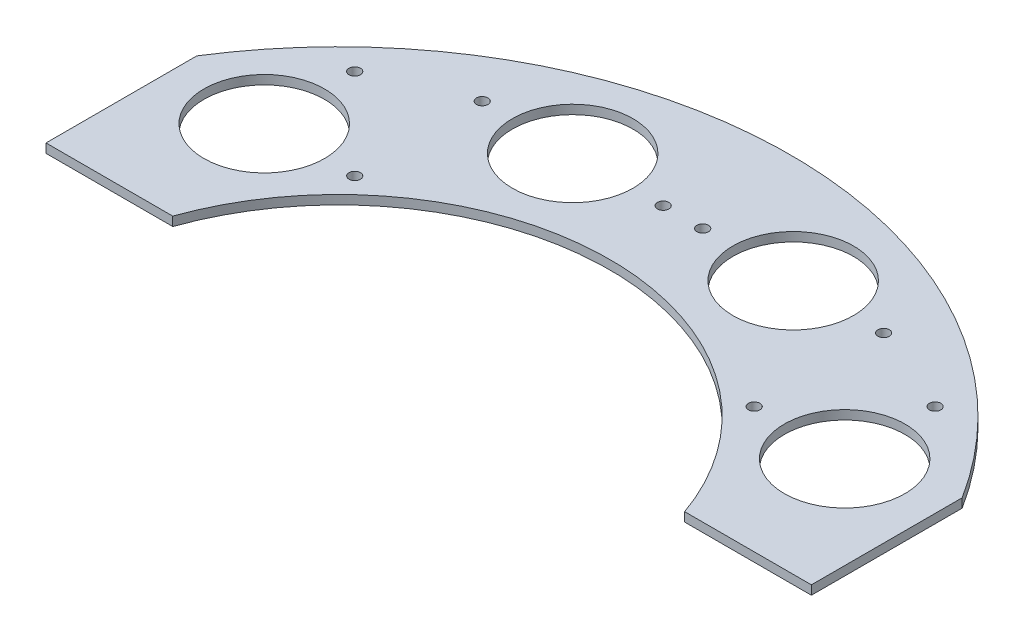
ISO-10303-21;
HEADER;
FILE_DESCRIPTION(('STEP AP214'),'2;1');
FILE_NAME('part.step','',(''),(''),'','','');
FILE_SCHEMA(('AUTOMOTIVE_DESIGN { 1 0 10303 214 1 1 1 1 }'));
ENDSEC;
DATA;
#1=APPLICATION_CONTEXT('core data for automotive mechanical design processes');
#2=APPLICATION_PROTOCOL_DEFINITION('international standard','automotive_design',2000,#1);
#3=PRODUCT_CONTEXT('',#1,'mechanical');
#4=PRODUCT('Part','Part','',(#3));
#5=PRODUCT_RELATED_PRODUCT_CATEGORY('part','',(#4));
#6=PRODUCT_DEFINITION_FORMATION('','',#4);
#7=PRODUCT_DEFINITION_CONTEXT('part definition',#1,'design');
#8=PRODUCT_DEFINITION('design','',#6,#7);
#9=PRODUCT_DEFINITION_SHAPE('','',#8);
#10=(LENGTH_UNIT() NAMED_UNIT(*) SI_UNIT(.MILLI.,.METRE.));
#11=(NAMED_UNIT(*) PLANE_ANGLE_UNIT() SI_UNIT($,.RADIAN.));
#12=(NAMED_UNIT(*) SI_UNIT($,.STERADIAN.) SOLID_ANGLE_UNIT());
#13=UNCERTAINTY_MEASURE_WITH_UNIT(LENGTH_MEASURE(1.E-05),#10,'distance_accuracy_value','');
#14=(GEOMETRIC_REPRESENTATION_CONTEXT(3) GLOBAL_UNCERTAINTY_ASSIGNED_CONTEXT((#13)) GLOBAL_UNIT_ASSIGNED_CONTEXT((#10,
#11,#12)) REPRESENTATION_CONTEXT('',''));
#15=CARTESIAN_POINT('',(0.,0.,0.));
#16=DIRECTION('',(0.,0.,1.));
#17=DIRECTION('',(1.,0.,0.));
#18=AXIS2_PLACEMENT_3D('',#15,#16,#17);
#19=CARTESIAN_POINT('',(126.885775404495,3.,0.));
#20=DIRECTION('',(-1.,0.,0.));
#21=DIRECTION('',(0.,0.,1.));
#22=AXIS2_PLACEMENT_3D('',#19,#20,#21);
#23=PLANE('',#22);
#24=DIRECTION('',(0.,0.,-1.));
#25=VECTOR('',#24,1.);
#26=CARTESIAN_POINT('',(126.885775404495,0.,0.));
#27=LINE('',#26,#25);
#28=CARTESIAN_POINT('',(126.885775404495,0.,16.7898324885886));
#29=VERTEX_POINT('',#28);
#30=CARTESIAN_POINT('',(126.885775404495,0.,-33.2101675114114));
#31=VERTEX_POINT('',#30);
#32=EDGE_CURVE('E133',#29,#31,#27,.T.);
#33=ORIENTED_EDGE('',*,*,#32,.T.);
#34=DIRECTION('',(0.,-1.,0.));
#35=VECTOR('',#34,1.);
#36=CARTESIAN_POINT('',(126.885775404495,3.,-33.2101675114114));
#37=LINE('',#36,#35);
#38=CARTESIAN_POINT('',(126.885775404495,3.,-33.2101675114114));
#39=VERTEX_POINT('',#38);
#40=EDGE_CURVE('E11',#39,#31,#37,.T.);
#41=ORIENTED_EDGE('',*,*,#40,.F.);
#42=DIRECTION('',(0.,0.,-1.));
#43=VECTOR('',#42,1.);
#44=CARTESIAN_POINT('',(126.885775404495,3.,0.));
#45=LINE('',#44,#43);
#46=CARTESIAN_POINT('',(126.885775404495,3.,16.7898324885886));
#47=VERTEX_POINT('',#46);
#48=EDGE_CURVE('E159',#47,#39,#45,.T.);
#49=ORIENTED_EDGE('',*,*,#48,.F.);
#50=DIRECTION('',(0.,-1.,0.));
#51=VECTOR('',#50,1.);
#52=CARTESIAN_POINT('',(126.885775404495,3.,16.7898324885886));
#53=LINE('',#52,#51);
#54=EDGE_CURVE('E116',#47,#29,#53,.T.);
#55=ORIENTED_EDGE('',*,*,#54,.T.);
#56=EDGE_LOOP('',(#33,#41,#49,#55));
#57=FACE_BOUND('',#56,.T.);
#58=ADVANCED_FACE('F37',(#57),#23,.F.);
#59=CARTESIAN_POINT('',(0.,3.,46.7898324885886));
#60=DIRECTION('',(0.,-1.,0.));
#61=DIRECTION('',(0.,0.,-1.));
#62=AXIS2_PLACEMENT_3D('',#59,#60,#61);
#63=CYLINDRICAL_SURFACE('',#62,150.);
#64=CARTESIAN_POINT('',(0.,0.,46.7898324885886));
#65=DIRECTION('',(0.,1.,0.));
#66=DIRECTION('',(0.,0.,1.));
#67=AXIS2_PLACEMENT_3D('',#64,#65,#66);
#68=CIRCLE('',#67,150.);
#69=CARTESIAN_POINT('',(-126.885775404495,0.,-33.2101675114114));
#70=VERTEX_POINT('',#69);
#71=EDGE_CURVE('E136',#31,#70,#68,.T.);
#72=ORIENTED_EDGE('',*,*,#71,.T.);
#73=DIRECTION('',(0.,-1.,0.));
#74=VECTOR('',#73,1.);
#75=CARTESIAN_POINT('',(-126.885775404495,3.,-33.2101675114114));
#76=LINE('',#75,#74);
#77=CARTESIAN_POINT('',(-126.885775404495,3.,-33.2101675114114));
#78=VERTEX_POINT('',#77);
#79=EDGE_CURVE('E46',#78,#70,#76,.T.);
#80=ORIENTED_EDGE('',*,*,#79,.F.);
#81=CARTESIAN_POINT('',(0.,3.,46.7898324885886));
#82=DIRECTION('',(0.,1.,0.));
#83=DIRECTION('',(0.,0.,1.));
#84=AXIS2_PLACEMENT_3D('',#81,#82,#83);
#85=CIRCLE('',#84,150.);
#86=EDGE_CURVE('E87',#39,#78,#85,.T.);
#87=ORIENTED_EDGE('',*,*,#86,.F.);
#88=ORIENTED_EDGE('',*,*,#40,.T.);
#89=EDGE_LOOP('',(#72,#80,#87,#88));
#90=FACE_BOUND('',#89,.T.);
#91=ADVANCED_FACE('F152',(#90),#63,.T.);
#92=CARTESIAN_POINT('',(-126.885775404495,3.,0.));
#93=DIRECTION('',(-1.,0.,0.));
#94=DIRECTION('',(0.,0.,1.));
#95=AXIS2_PLACEMENT_3D('',#92,#93,#94);
#96=PLANE('',#95);
#97=DIRECTION('',(0.,0.,-1.));
#98=VECTOR('',#97,1.);
#99=CARTESIAN_POINT('',(-126.885775404495,0.,0.));
#100=LINE('',#99,#98);
#101=CARTESIAN_POINT('',(-126.885775404495,0.,16.7898324885886));
#102=VERTEX_POINT('',#101);
#103=EDGE_CURVE('E139',#102,#70,#100,.T.);
#104=ORIENTED_EDGE('',*,*,#103,.F.);
#105=DIRECTION('',(0.,-1.,0.));
#106=VECTOR('',#105,1.);
#107=CARTESIAN_POINT('',(-126.885775404495,3.,16.7898324885886));
#108=LINE('',#107,#106);
#109=CARTESIAN_POINT('',(-126.885775404495,3.,16.7898324885886));
#110=VERTEX_POINT('',#109);
#111=EDGE_CURVE('E112',#110,#102,#108,.T.);
#112=ORIENTED_EDGE('',*,*,#111,.F.);
#113=DIRECTION('',(0.,0.,-1.));
#114=VECTOR('',#113,1.);
#115=CARTESIAN_POINT('',(-126.885775404495,3.,0.));
#116=LINE('',#115,#114);
#117=EDGE_CURVE('E101',#110,#78,#116,.T.);
#118=ORIENTED_EDGE('',*,*,#117,.T.);
#119=ORIENTED_EDGE('',*,*,#79,.T.);
#120=EDGE_LOOP('',(#104,#112,#118,#119));
#121=FACE_BOUND('',#120,.T.);
#122=ADVANCED_FACE('F151',(#121),#96,.T.);
#123=CARTESIAN_POINT('',(0.,3.,16.7898324885886));
#124=DIRECTION('',(0.,0.,-1.));
#125=DIRECTION('',(-1.,0.,0.));
#126=AXIS2_PLACEMENT_3D('',#123,#124,#125);
#127=PLANE('',#126);
#128=DIRECTION('',(1.,0.,0.));
#129=VECTOR('',#128,1.);
#130=CARTESIAN_POINT('',(0.,0.,16.7898324885886));
#131=LINE('',#130,#129);
#132=CARTESIAN_POINT('',(-84.8716884499019,0.,16.7898324885886));
#133=VERTEX_POINT('',#132);
#134=EDGE_CURVE('E108',#102,#133,#131,.T.);
#135=ORIENTED_EDGE('',*,*,#134,.T.);
#136=DIRECTION('',(0.,-1.,0.));
#137=VECTOR('',#136,1.);
#138=CARTESIAN_POINT('',(-84.8716884499019,3.,16.7898324885886));
#139=LINE('',#138,#137);
#140=CARTESIAN_POINT('',(-84.8716884499019,3.,16.7898324885886));
#141=VERTEX_POINT('',#140);
#142=EDGE_CURVE('E105',#141,#133,#139,.T.);
#143=ORIENTED_EDGE('',*,*,#142,.F.);
#144=DIRECTION('',(1.,0.,0.));
#145=VECTOR('',#144,1.);
#146=CARTESIAN_POINT('',(0.,3.,16.7898324885886));
#147=LINE('',#146,#145);
#148=EDGE_CURVE('E95',#110,#141,#147,.T.);
#149=ORIENTED_EDGE('',*,*,#148,.F.);
#150=ORIENTED_EDGE('',*,*,#111,.T.);
#151=EDGE_LOOP('',(#135,#143,#149,#150));
#152=FACE_BOUND('',#151,.T.);
#153=ADVANCED_FACE('F106',(#152),#127,.F.);
#154=CARTESIAN_POINT('',(0.,3.,46.7898324885886));
#155=DIRECTION('',(0.,-1.,0.));
#156=DIRECTION('',(0.,0.,-1.));
#157=AXIS2_PLACEMENT_3D('',#154,#155,#156);
#158=CYLINDRICAL_SURFACE('',#157,90.0177954647702);
#159=CARTESIAN_POINT('',(0.,0.,46.7898324885886));
#160=DIRECTION('',(0.,1.,0.));
#161=DIRECTION('',(0.,0.,1.));
#162=AXIS2_PLACEMENT_3D('',#159,#160,#161);
#163=CIRCLE('',#162,90.0177954647702);
#164=CARTESIAN_POINT('',(84.8716884499019,0.,16.7898324885886));
#165=VERTEX_POINT('',#164);
#166=EDGE_CURVE('E143',#165,#133,#163,.T.);
#167=ORIENTED_EDGE('',*,*,#166,.F.);
#168=DIRECTION('',(0.,-1.,0.));
#169=VECTOR('',#168,1.);
#170=CARTESIAN_POINT('',(84.8716884499019,3.,16.7898324885886));
#171=LINE('',#170,#169);
#172=CARTESIAN_POINT('',(84.8716884499019,3.,16.7898324885886));
#173=VERTEX_POINT('',#172);
#174=EDGE_CURVE('E76',#173,#165,#171,.T.);
#175=ORIENTED_EDGE('',*,*,#174,.F.);
#176=CARTESIAN_POINT('',(0.,3.,46.7898324885886));
#177=DIRECTION('',(0.,1.,0.));
#178=DIRECTION('',(0.,0.,1.));
#179=AXIS2_PLACEMENT_3D('',#176,#177,#178);
#180=CIRCLE('',#179,90.0177954647702);
#181=EDGE_CURVE('E99',#173,#141,#180,.T.);
#182=ORIENTED_EDGE('',*,*,#181,.T.);
#183=ORIENTED_EDGE('',*,*,#142,.T.);
#184=EDGE_LOOP('',(#167,#175,#182,#183));
#185=FACE_BOUND('',#184,.T.);
#186=ADVANCED_FACE('F114',(#185),#158,.F.);
#187=CARTESIAN_POINT('',(36.5556268754658,3.,-67.5066510257423));
#188=DIRECTION('',(0.,-1.,0.));
#189=DIRECTION('',(0.,0.,-1.));
#190=AXIS2_PLACEMENT_3D('',#187,#188,#189);
#191=CYLINDRICAL_SURFACE('',#190,20.);
#192=CARTESIAN_POINT('',(36.5556268754658,3.,-67.5066510257423));
#193=DIRECTION('',(0.,1.,0.));
#194=DIRECTION('',(0.,0.,1.));
#195=AXIS2_PLACEMENT_3D('',#192,#193,#194);
#196=CIRCLE('',#195,20.);
#197=CARTESIAN_POINT('',(36.5556268754658,3.,-47.5066510257423));
#198=VERTEX_POINT('',#197);
#199=EDGE_CURVE('E302',#198,#198,#196,.F.);
#200=ORIENTED_EDGE('',*,*,#199,.F.);
#201=EDGE_LOOP('',(#200));
#202=FACE_BOUND('',#201,.T.);
#203=CARTESIAN_POINT('',(36.5556268754658,0.,-67.5066510257423));
#204=DIRECTION('',(0.,1.,0.));
#205=DIRECTION('',(0.,0.,1.));
#206=AXIS2_PLACEMENT_3D('',#203,#204,#205);
#207=CIRCLE('',#206,20.);
#208=CARTESIAN_POINT('',(36.5556268754658,0.,-47.5066510257423));
#209=VERTEX_POINT('',#208);
#210=EDGE_CURVE('E130',#209,#209,#207,.F.);
#211=ORIENTED_EDGE('',*,*,#210,.T.);
#212=EDGE_LOOP('',(#211));
#213=FACE_BOUND('',#212,.T.);
#214=ADVANCED_FACE('F182',(#202,#213),#191,.F.);
#215=CARTESIAN_POINT('',(-96.2238553059831,3.,-24.9107230884307));
#216=DIRECTION('',(0.,-1.,0.));
#217=DIRECTION('',(0.,0.,-1.));
#218=AXIS2_PLACEMENT_3D('',#215,#216,#217);
#219=CYLINDRICAL_SURFACE('',#218,20.);
#220=CARTESIAN_POINT('',(-96.2238553059831,3.,-24.9107230884307));
#221=DIRECTION('',(0.,1.,0.));
#222=DIRECTION('',(0.,0.,1.));
#223=AXIS2_PLACEMENT_3D('',#220,#221,#222);
#224=CIRCLE('',#223,20.);
#225=CARTESIAN_POINT('',(-96.2238553059831,3.,-4.91072308843064));
#226=VERTEX_POINT('',#225);
#227=EDGE_CURVE('E299',#226,#226,#224,.T.);
#228=ORIENTED_EDGE('',*,*,#227,.T.);
#229=EDGE_LOOP('',(#228));
#230=FACE_BOUND('',#229,.T.);
#231=CARTESIAN_POINT('',(-96.2238553059831,0.,-24.9107230884307));
#232=DIRECTION('',(0.,1.,0.));
#233=DIRECTION('',(0.,0.,1.));
#234=AXIS2_PLACEMENT_3D('',#231,#232,#233);
#235=CIRCLE('',#234,20.);
#236=CARTESIAN_POINT('',(-96.2238553059831,0.,-4.91072308843064));
#237=VERTEX_POINT('',#236);
#238=EDGE_CURVE('E127',#237,#237,#235,.T.);
#239=ORIENTED_EDGE('',*,*,#238,.F.);
#240=EDGE_LOOP('',(#239));
#241=FACE_BOUND('',#240,.T.);
#242=ADVANCED_FACE('F185',(#230,#241),#219,.F.);
#243=CARTESIAN_POINT('',(-36.5556268754658,3.,-67.5066510257423));
#244=DIRECTION('',(0.,-1.,0.));
#245=DIRECTION('',(0.,0.,-1.));
#246=AXIS2_PLACEMENT_3D('',#243,#244,#245);
#247=CYLINDRICAL_SURFACE('',#246,20.);
#248=CARTESIAN_POINT('',(-36.5556268754658,3.,-67.5066510257423));
#249=DIRECTION('',(0.,1.,0.));
#250=DIRECTION('',(0.,0.,1.));
#251=AXIS2_PLACEMENT_3D('',#248,#249,#250);
#252=CIRCLE('',#251,20.);
#253=CARTESIAN_POINT('',(-36.5556268754658,3.,-47.5066510257423));
#254=VERTEX_POINT('',#253);
#255=EDGE_CURVE('E196',#254,#254,#252,.T.);
#256=ORIENTED_EDGE('',*,*,#255,.T.);
#257=EDGE_LOOP('',(#256));
#258=FACE_BOUND('',#257,.T.);
#259=CARTESIAN_POINT('',(-36.5556268754658,0.,-67.5066510257423));
#260=DIRECTION('',(0.,1.,0.));
#261=DIRECTION('',(0.,0.,1.));
#262=AXIS2_PLACEMENT_3D('',#259,#260,#261);
#263=CIRCLE('',#262,20.);
#264=CARTESIAN_POINT('',(-36.5556268754658,0.,-47.5066510257423));
#265=VERTEX_POINT('',#264);
#266=EDGE_CURVE('E123',#265,#265,#263,.T.);
#267=ORIENTED_EDGE('',*,*,#266,.F.);
#268=EDGE_LOOP('',(#267));
#269=FACE_BOUND('',#268,.T.);
#270=ADVANCED_FACE('F170',(#258,#269),#247,.F.);
#271=CARTESIAN_POINT('',(96.2238553059831,3.,-24.9107230884307));
#272=DIRECTION('',(0.,-1.,0.));
#273=DIRECTION('',(0.,0.,-1.));
#274=AXIS2_PLACEMENT_3D('',#271,#272,#273);
#275=CYLINDRICAL_SURFACE('',#274,20.);
#276=CARTESIAN_POINT('',(96.2238553059831,3.,-24.9107230884307));
#277=DIRECTION('',(0.,1.,0.));
#278=DIRECTION('',(0.,0.,1.));
#279=AXIS2_PLACEMENT_3D('',#276,#277,#278);
#280=CIRCLE('',#279,20.);
#281=CARTESIAN_POINT('',(96.2238553059831,3.,-4.91072308843069));
#282=VERTEX_POINT('',#281);
#283=EDGE_CURVE('E146',#282,#282,#280,.F.);
#284=ORIENTED_EDGE('',*,*,#283,.F.);
#285=EDGE_LOOP('',(#284));
#286=FACE_BOUND('',#285,.T.);
#287=CARTESIAN_POINT('',(96.2238553059831,0.,-24.9107230884307));
#288=DIRECTION('',(0.,1.,0.));
#289=DIRECTION('',(0.,0.,1.));
#290=AXIS2_PLACEMENT_3D('',#287,#288,#289);
#291=CIRCLE('',#290,20.);
#292=CARTESIAN_POINT('',(96.2238553059831,0.,-4.91072308843069));
#293=VERTEX_POINT('',#292);
#294=EDGE_CURVE('E120',#293,#293,#291,.F.);
#295=ORIENTED_EDGE('',*,*,#294,.T.);
#296=EDGE_LOOP('',(#295));
#297=FACE_BOUND('',#296,.T.);
#298=ADVANCED_FACE('F39',(#286,#297),#275,.F.);
#299=CARTESIAN_POINT('',(0.,3.,16.7898324885886));
#300=DIRECTION('',(0.,0.,-1.));
#301=DIRECTION('',(-1.,0.,0.));
#302=AXIS2_PLACEMENT_3D('',#299,#300,#301);
#303=PLANE('',#302);
#304=DIRECTION('',(1.,0.,0.));
#305=VECTOR('',#304,1.);
#306=CARTESIAN_POINT('',(0.,0.,16.7898324885886));
#307=LINE('',#306,#305);
#308=EDGE_CURVE('E79',#165,#29,#307,.T.);
#309=ORIENTED_EDGE('',*,*,#308,.T.);
#310=ORIENTED_EDGE('',*,*,#54,.F.);
#311=DIRECTION('',(1.,0.,0.));
#312=VECTOR('',#311,1.);
#313=CARTESIAN_POINT('',(0.,3.,16.7898324885886));
#314=LINE('',#313,#312);
#315=EDGE_CURVE('E54',#173,#47,#314,.T.);
#316=ORIENTED_EDGE('',*,*,#315,.F.);
#317=ORIENTED_EDGE('',*,*,#174,.T.);
#318=EDGE_LOOP('',(#309,#310,#316,#317));
#319=FACE_BOUND('',#318,.T.);
#320=ADVANCED_FACE('F160',(#319),#303,.F.);
#321=CARTESIAN_POINT('',(0.,3.,0.));
#322=DIRECTION('',(0.,1.,0.));
#323=DIRECTION('',(0.,0.,1.));
#324=AXIS2_PLACEMENT_3D('',#321,#322,#323);
#325=PLANE('',#324);
#326=CARTESIAN_POINT('',(-66.2238553059831,3.,-24.9107230884307));
#327=DIRECTION('',(0.,1.,0.));
#328=DIRECTION('',(0.,0.,1.));
#329=AXIS2_PLACEMENT_3D('',#326,#327,#328);
#330=CIRCLE('',#329,1.89865);
#331=CARTESIAN_POINT('',(-66.2238553059831,3.,-23.0120730884307));
#332=VERTEX_POINT('',#331);
#333=EDGE_CURVE('E251',#332,#332,#330,.T.);
#334=ORIENTED_EDGE('',*,*,#333,.F.);
#335=EDGE_LOOP('',(#334));
#336=FACE_BOUND('',#335,.T.);
#337=CARTESIAN_POINT('',(-96.2238553059831,3.,-54.9107230884307));
#338=DIRECTION('',(0.,1.,0.));
#339=DIRECTION('',(0.,0.,1.));
#340=AXIS2_PLACEMENT_3D('',#337,#338,#339);
#341=CIRCLE('',#340,1.89865);
#342=CARTESIAN_POINT('',(-96.2238553059831,3.,-53.0120730884307));
#343=VERTEX_POINT('',#342);
#344=EDGE_CURVE('E253',#343,#343,#341,.T.);
#345=ORIENTED_EDGE('',*,*,#344,.F.);
#346=EDGE_LOOP('',(#345));
#347=FACE_BOUND('',#346,.T.);
#348=CARTESIAN_POINT('',(-66.5556268754658,3.,-67.5066510257423));
#349=DIRECTION('',(0.,1.,0.));
#350=DIRECTION('',(0.,0.,1.));
#351=AXIS2_PLACEMENT_3D('',#348,#349,#350);
#352=CIRCLE('',#351,1.89865);
#353=CARTESIAN_POINT('',(-66.5556268754658,3.,-65.6080010257423));
#354=VERTEX_POINT('',#353);
#355=EDGE_CURVE('E261',#354,#354,#352,.T.);
#356=ORIENTED_EDGE('',*,*,#355,.F.);
#357=EDGE_LOOP('',(#356));
#358=FACE_BOUND('',#357,.T.);
#359=CARTESIAN_POINT('',(-6.55562687546583,3.,-67.5066510257423));
#360=DIRECTION('',(0.,1.,0.));
#361=DIRECTION('',(0.,0.,1.));
#362=AXIS2_PLACEMENT_3D('',#359,#360,#361);
#363=CIRCLE('',#362,1.89865);
#364=CARTESIAN_POINT('',(-6.55562687546583,3.,-65.6080010257423));
#365=VERTEX_POINT('',#364);
#366=EDGE_CURVE('E267',#365,#365,#363,.T.);
#367=ORIENTED_EDGE('',*,*,#366,.F.);
#368=EDGE_LOOP('',(#367));
#369=FACE_BOUND('',#368,.T.);
#370=CARTESIAN_POINT('',(6.55562687546583,3.,-67.5066510257423));
#371=DIRECTION('',(0.,1.,0.));
#372=DIRECTION('',(0.,0.,1.));
#373=AXIS2_PLACEMENT_3D('',#370,#371,#372);
#374=CIRCLE('',#373,1.89865);
#375=CARTESIAN_POINT('',(6.55562687546583,3.,-65.6080010257423));
#376=VERTEX_POINT('',#375);
#377=EDGE_CURVE('E273',#376,#376,#374,.T.);
#378=ORIENTED_EDGE('',*,*,#377,.F.);
#379=EDGE_LOOP('',(#378));
#380=FACE_BOUND('',#379,.T.);
#381=CARTESIAN_POINT('',(66.5556268754658,3.,-67.5066510257423));
#382=DIRECTION('',(0.,1.,0.));
#383=DIRECTION('',(0.,0.,1.));
#384=AXIS2_PLACEMENT_3D('',#381,#382,#383);
#385=CIRCLE('',#384,1.89865);
#386=CARTESIAN_POINT('',(66.5556268754658,3.,-65.6080010257423));
#387=VERTEX_POINT('',#386);
#388=EDGE_CURVE('E279',#387,#387,#385,.T.);
#389=ORIENTED_EDGE('',*,*,#388,.F.);
#390=EDGE_LOOP('',(#389));
#391=FACE_BOUND('',#390,.T.);
#392=CARTESIAN_POINT('',(96.2238553059831,3.,-54.9107230884307));
#393=DIRECTION('',(0.,1.,0.));
#394=DIRECTION('',(0.,0.,1.));
#395=AXIS2_PLACEMENT_3D('',#392,#393,#394);
#396=CIRCLE('',#395,1.89865);
#397=CARTESIAN_POINT('',(96.2238553059831,3.,-53.0120730884307));
#398=VERTEX_POINT('',#397);
#399=EDGE_CURVE('E285',#398,#398,#396,.T.);
#400=ORIENTED_EDGE('',*,*,#399,.F.);
#401=EDGE_LOOP('',(#400));
#402=FACE_BOUND('',#401,.T.);
#403=CARTESIAN_POINT('',(66.2238553059831,3.,-24.9107230884307));
#404=DIRECTION('',(0.,1.,0.));
#405=DIRECTION('',(0.,0.,1.));
#406=AXIS2_PLACEMENT_3D('',#403,#404,#405);
#407=CIRCLE('',#406,1.89865);
#408=CARTESIAN_POINT('',(66.2238553059831,3.,-23.0120730884307));
#409=VERTEX_POINT('',#408);
#410=EDGE_CURVE('E291',#409,#409,#407,.T.);
#411=ORIENTED_EDGE('',*,*,#410,.F.);
#412=EDGE_LOOP('',(#411));
#413=FACE_BOUND('',#412,.T.);
#414=ORIENTED_EDGE('',*,*,#283,.T.);
#415=EDGE_LOOP('',(#414));
#416=FACE_BOUND('',#415,.T.);
#417=ORIENTED_EDGE('',*,*,#255,.F.);
#418=EDGE_LOOP('',(#417));
#419=FACE_BOUND('',#418,.T.);
#420=ORIENTED_EDGE('',*,*,#227,.F.);
#421=EDGE_LOOP('',(#420));
#422=FACE_BOUND('',#421,.T.);
#423=ORIENTED_EDGE('',*,*,#199,.T.);
#424=EDGE_LOOP('',(#423));
#425=FACE_BOUND('',#424,.T.);
#426=ORIENTED_EDGE('',*,*,#48,.T.);
#427=ORIENTED_EDGE('',*,*,#86,.T.);
#428=ORIENTED_EDGE('',*,*,#117,.F.);
#429=ORIENTED_EDGE('',*,*,#148,.T.);
#430=ORIENTED_EDGE('',*,*,#181,.F.);
#431=ORIENTED_EDGE('',*,*,#315,.T.);
#432=EDGE_LOOP('',(#426,#427,#428,#429,#430,#431));
#433=FACE_BOUND('',#432,.T.);
#434=ADVANCED_FACE('F97',(#336,#347,#358,#369,#380,#391,#402,#413,#416,#419,#422,#425,#433),
#325,.T.);
#435=CARTESIAN_POINT('',(0.,0.,0.));
#436=DIRECTION('',(0.,1.,0.));
#437=DIRECTION('',(0.,0.,1.));
#438=AXIS2_PLACEMENT_3D('',#435,#436,#437);
#439=PLANE('',#438);
#440=CARTESIAN_POINT('',(-66.2238553059831,0.,-24.9107230884307));
#441=DIRECTION('',(0.,1.,0.));
#442=DIRECTION('',(0.,0.,1.));
#443=AXIS2_PLACEMENT_3D('',#440,#441,#442);
#444=CIRCLE('',#443,1.89865);
#445=CARTESIAN_POINT('',(-66.2238553059831,0.,-23.0120730884307));
#446=VERTEX_POINT('',#445);
#447=EDGE_CURVE('E248',#446,#446,#444,.T.);
#448=ORIENTED_EDGE('',*,*,#447,.T.);
#449=EDGE_LOOP('',(#448));
#450=FACE_BOUND('',#449,.T.);
#451=CARTESIAN_POINT('',(-96.2238553059831,0.,-54.9107230884307));
#452=DIRECTION('',(0.,1.,0.));
#453=DIRECTION('',(0.,0.,1.));
#454=AXIS2_PLACEMENT_3D('',#451,#452,#453);
#455=CIRCLE('',#454,1.89865);
#456=CARTESIAN_POINT('',(-96.2238553059831,0.,-53.0120730884307));
#457=VERTEX_POINT('',#456);
#458=EDGE_CURVE('E258',#457,#457,#455,.T.);
#459=ORIENTED_EDGE('',*,*,#458,.T.);
#460=EDGE_LOOP('',(#459));
#461=FACE_BOUND('',#460,.T.);
#462=CARTESIAN_POINT('',(-66.5556268754658,0.,-67.5066510257423));
#463=DIRECTION('',(0.,1.,0.));
#464=DIRECTION('',(0.,0.,1.));
#465=AXIS2_PLACEMENT_3D('',#462,#463,#464);
#466=CIRCLE('',#465,1.89865);
#467=CARTESIAN_POINT('',(-66.5556268754658,0.,-65.6080010257423));
#468=VERTEX_POINT('',#467);
#469=EDGE_CURVE('E264',#468,#468,#466,.T.);
#470=ORIENTED_EDGE('',*,*,#469,.T.);
#471=EDGE_LOOP('',(#470));
#472=FACE_BOUND('',#471,.T.);
#473=CARTESIAN_POINT('',(-6.55562687546583,0.,-67.5066510257423));
#474=DIRECTION('',(0.,1.,0.));
#475=DIRECTION('',(0.,0.,1.));
#476=AXIS2_PLACEMENT_3D('',#473,#474,#475);
#477=CIRCLE('',#476,1.89865);
#478=CARTESIAN_POINT('',(-6.55562687546583,0.,-65.6080010257423));
#479=VERTEX_POINT('',#478);
#480=EDGE_CURVE('E270',#479,#479,#477,.T.);
#481=ORIENTED_EDGE('',*,*,#480,.T.);
#482=EDGE_LOOP('',(#481));
#483=FACE_BOUND('',#482,.T.);
#484=CARTESIAN_POINT('',(6.55562687546583,0.,-67.5066510257423));
#485=DIRECTION('',(0.,1.,0.));
#486=DIRECTION('',(0.,0.,1.));
#487=AXIS2_PLACEMENT_3D('',#484,#485,#486);
#488=CIRCLE('',#487,1.89864999999999);
#489=CARTESIAN_POINT('',(6.55562687546583,0.,-65.6080010257424));
#490=VERTEX_POINT('',#489);
#491=EDGE_CURVE('E276',#490,#490,#488,.T.);
#492=ORIENTED_EDGE('',*,*,#491,.T.);
#493=EDGE_LOOP('',(#492));
#494=FACE_BOUND('',#493,.T.);
#495=CARTESIAN_POINT('',(66.5556268754658,0.,-67.5066510257423));
#496=DIRECTION('',(0.,1.,0.));
#497=DIRECTION('',(0.,0.,1.));
#498=AXIS2_PLACEMENT_3D('',#495,#496,#497);
#499=CIRCLE('',#498,1.89865);
#500=CARTESIAN_POINT('',(66.5556268754658,0.,-65.6080010257423));
#501=VERTEX_POINT('',#500);
#502=EDGE_CURVE('E282',#501,#501,#499,.T.);
#503=ORIENTED_EDGE('',*,*,#502,.T.);
#504=EDGE_LOOP('',(#503));
#505=FACE_BOUND('',#504,.T.);
#506=CARTESIAN_POINT('',(96.2238553059831,0.,-54.9107230884307));
#507=DIRECTION('',(0.,1.,0.));
#508=DIRECTION('',(0.,0.,1.));
#509=AXIS2_PLACEMENT_3D('',#506,#507,#508);
#510=CIRCLE('',#509,1.89865);
#511=CARTESIAN_POINT('',(96.2238553059831,0.,-53.0120730884307));
#512=VERTEX_POINT('',#511);
#513=EDGE_CURVE('E288',#512,#512,#510,.T.);
#514=ORIENTED_EDGE('',*,*,#513,.T.);
#515=EDGE_LOOP('',(#514));
#516=FACE_BOUND('',#515,.T.);
#517=CARTESIAN_POINT('',(66.2238553059831,0.,-24.9107230884307));
#518=DIRECTION('',(0.,1.,0.));
#519=DIRECTION('',(0.,0.,1.));
#520=AXIS2_PLACEMENT_3D('',#517,#518,#519);
#521=CIRCLE('',#520,1.89865);
#522=CARTESIAN_POINT('',(66.2238553059831,0.,-23.0120730884307));
#523=VERTEX_POINT('',#522);
#524=EDGE_CURVE('E124',#523,#523,#521,.T.);
#525=ORIENTED_EDGE('',*,*,#524,.T.);
#526=EDGE_LOOP('',(#525));
#527=FACE_BOUND('',#526,.T.);
#528=ORIENTED_EDGE('',*,*,#294,.F.);
#529=EDGE_LOOP('',(#528));
#530=FACE_BOUND('',#529,.T.);
#531=ORIENTED_EDGE('',*,*,#266,.T.);
#532=EDGE_LOOP('',(#531));
#533=FACE_BOUND('',#532,.T.);
#534=ORIENTED_EDGE('',*,*,#238,.T.);
#535=EDGE_LOOP('',(#534));
#536=FACE_BOUND('',#535,.T.);
#537=ORIENTED_EDGE('',*,*,#210,.F.);
#538=EDGE_LOOP('',(#537));
#539=FACE_BOUND('',#538,.T.);
#540=ORIENTED_EDGE('',*,*,#32,.F.);
#541=ORIENTED_EDGE('',*,*,#308,.F.);
#542=ORIENTED_EDGE('',*,*,#166,.T.);
#543=ORIENTED_EDGE('',*,*,#134,.F.);
#544=ORIENTED_EDGE('',*,*,#103,.T.);
#545=ORIENTED_EDGE('',*,*,#71,.F.);
#546=EDGE_LOOP('',(#540,#541,#542,#543,#544,#545));
#547=FACE_BOUND('',#546,.T.);
#548=ADVANCED_FACE('F156',(#450,#461,#472,#483,#494,#505,#516,#527,#530,#533,#536,#539,#547),
#439,.F.);
#549=CARTESIAN_POINT('',(66.2238553059831,3.,-24.9107230884307));
#550=DIRECTION('',(0.,1.,0.));
#551=DIRECTION('',(0.,0.,1.));
#552=AXIS2_PLACEMENT_3D('',#549,#550,#551);
#553=CYLINDRICAL_SURFACE('',#552,1.89865);
#554=ORIENTED_EDGE('',*,*,#524,.F.);
#555=EDGE_LOOP('',(#554));
#556=FACE_BOUND('',#555,.T.);
#557=ORIENTED_EDGE('',*,*,#410,.T.);
#558=EDGE_LOOP('',(#557));
#559=FACE_BOUND('',#558,.T.);
#560=ADVANCED_FACE('F201',(#556,#559),#553,.F.);
#561=CARTESIAN_POINT('',(96.2238553059831,3.,-54.9107230884307));
#562=DIRECTION('',(0.,1.,0.));
#563=DIRECTION('',(0.,0.,1.));
#564=AXIS2_PLACEMENT_3D('',#561,#562,#563);
#565=CYLINDRICAL_SURFACE('',#564,1.89865);
#566=ORIENTED_EDGE('',*,*,#513,.F.);
#567=EDGE_LOOP('',(#566));
#568=FACE_BOUND('',#567,.T.);
#569=ORIENTED_EDGE('',*,*,#399,.T.);
#570=EDGE_LOOP('',(#569));
#571=FACE_BOUND('',#570,.T.);
#572=ADVANCED_FACE('F212',(#568,#571),#565,.F.);
#573=CARTESIAN_POINT('',(66.5556268754658,3.,-67.5066510257423));
#574=DIRECTION('',(0.,1.,0.));
#575=DIRECTION('',(0.,0.,1.));
#576=AXIS2_PLACEMENT_3D('',#573,#574,#575);
#577=CYLINDRICAL_SURFACE('',#576,1.89865);
#578=ORIENTED_EDGE('',*,*,#502,.F.);
#579=EDGE_LOOP('',(#578));
#580=FACE_BOUND('',#579,.T.);
#581=ORIENTED_EDGE('',*,*,#388,.T.);
#582=EDGE_LOOP('',(#581));
#583=FACE_BOUND('',#582,.T.);
#584=ADVANCED_FACE('F220',(#580,#583),#577,.F.);
#585=CARTESIAN_POINT('',(6.55562687546583,3.,-67.5066510257423));
#586=DIRECTION('',(0.,1.,0.));
#587=DIRECTION('',(0.,0.,1.));
#588=AXIS2_PLACEMENT_3D('',#585,#586,#587);
#589=CYLINDRICAL_SURFACE('',#588,1.89865);
#590=ORIENTED_EDGE('',*,*,#491,.F.);
#591=EDGE_LOOP('',(#590));
#592=FACE_BOUND('',#591,.T.);
#593=ORIENTED_EDGE('',*,*,#377,.T.);
#594=EDGE_LOOP('',(#593));
#595=FACE_BOUND('',#594,.T.);
#596=ADVANCED_FACE('F224',(#592,#595),#589,.F.);
#597=CARTESIAN_POINT('',(-6.55562687546583,3.,-67.5066510257423));
#598=DIRECTION('',(0.,1.,0.));
#599=DIRECTION('',(0.,0.,1.));
#600=AXIS2_PLACEMENT_3D('',#597,#598,#599);
#601=CYLINDRICAL_SURFACE('',#600,1.89865);
#602=ORIENTED_EDGE('',*,*,#480,.F.);
#603=EDGE_LOOP('',(#602));
#604=FACE_BOUND('',#603,.T.);
#605=ORIENTED_EDGE('',*,*,#366,.T.);
#606=EDGE_LOOP('',(#605));
#607=FACE_BOUND('',#606,.T.);
#608=ADVANCED_FACE('F228',(#604,#607),#601,.F.);
#609=CARTESIAN_POINT('',(-66.5556268754658,3.,-67.5066510257423));
#610=DIRECTION('',(0.,1.,0.));
#611=DIRECTION('',(0.,0.,1.));
#612=AXIS2_PLACEMENT_3D('',#609,#610,#611);
#613=CYLINDRICAL_SURFACE('',#612,1.89865);
#614=ORIENTED_EDGE('',*,*,#469,.F.);
#615=EDGE_LOOP('',(#614));
#616=FACE_BOUND('',#615,.T.);
#617=ORIENTED_EDGE('',*,*,#355,.T.);
#618=EDGE_LOOP('',(#617));
#619=FACE_BOUND('',#618,.T.);
#620=ADVANCED_FACE('F232',(#616,#619),#613,.F.);
#621=CARTESIAN_POINT('',(-96.2238553059831,3.,-54.9107230884307));
#622=DIRECTION('',(0.,1.,0.));
#623=DIRECTION('',(0.,0.,1.));
#624=AXIS2_PLACEMENT_3D('',#621,#622,#623);
#625=CYLINDRICAL_SURFACE('',#624,1.89865);
#626=ORIENTED_EDGE('',*,*,#458,.F.);
#627=EDGE_LOOP('',(#626));
#628=FACE_BOUND('',#627,.T.);
#629=ORIENTED_EDGE('',*,*,#344,.T.);
#630=EDGE_LOOP('',(#629));
#631=FACE_BOUND('',#630,.T.);
#632=ADVANCED_FACE('F236',(#628,#631),#625,.F.);
#633=CARTESIAN_POINT('',(-66.2238553059831,3.,-24.9107230884307));
#634=DIRECTION('',(0.,1.,0.));
#635=DIRECTION('',(0.,0.,1.));
#636=AXIS2_PLACEMENT_3D('',#633,#634,#635);
#637=CYLINDRICAL_SURFACE('',#636,1.89865);
#638=ORIENTED_EDGE('',*,*,#447,.F.);
#639=EDGE_LOOP('',(#638));
#640=FACE_BOUND('',#639,.T.);
#641=ORIENTED_EDGE('',*,*,#333,.T.);
#642=EDGE_LOOP('',(#641));
#643=FACE_BOUND('',#642,.T.);
#644=ADVANCED_FACE('F240',(#640,#643),#637,.F.);
#645=CLOSED_SHELL('',(#58,#91,#122,#153,#186,#214,#242,#270,#298,#320,#434,#548,#560,#572,#584,
#596,#608,#620,#632,#644));
#646=MANIFOLD_SOLID_BREP('B2',#645);
#647=ADVANCED_BREP_SHAPE_REPRESENTATION('',(#18,#646),#14);
#648=SHAPE_DEFINITION_REPRESENTATION(#9,#647);
ENDSEC;
END-ISO-10303-21;
